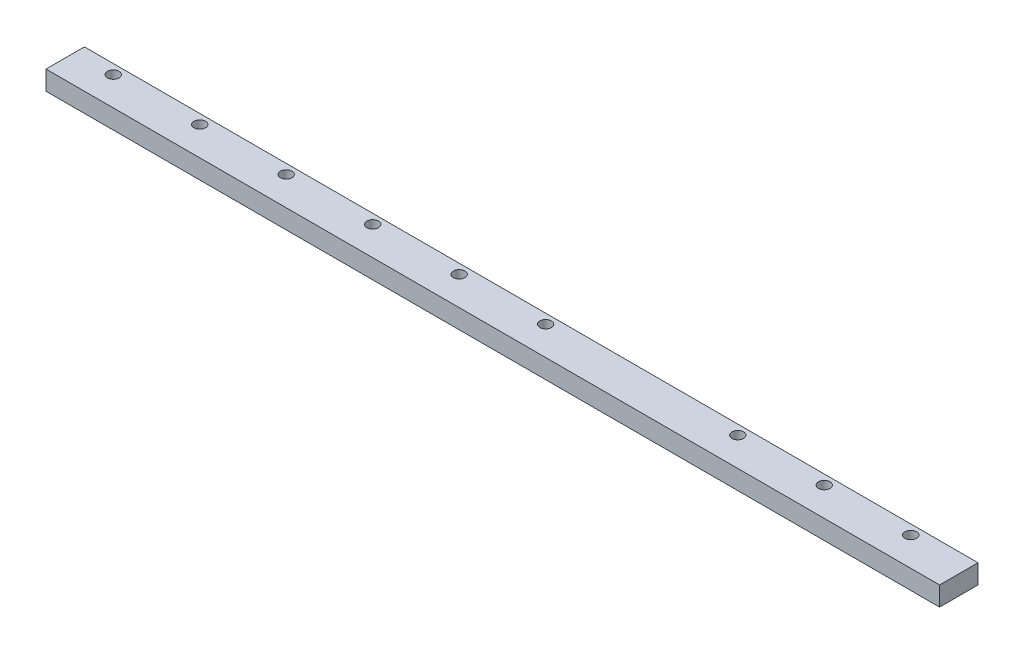
ISO-10303-21;
HEADER;
FILE_DESCRIPTION(('STEP AP214'),'2;1');
FILE_NAME('part.step','',(''),(''),'','','');
FILE_SCHEMA(('AUTOMOTIVE_DESIGN { 1 0 10303 214 1 1 1 1 }'));
ENDSEC;
DATA;
#1=APPLICATION_CONTEXT('core data for automotive mechanical design processes');
#2=APPLICATION_PROTOCOL_DEFINITION('international standard','automotive_design',2000,#1);
#3=PRODUCT_CONTEXT('',#1,'mechanical');
#4=PRODUCT('Part','Part','',(#3));
#5=PRODUCT_RELATED_PRODUCT_CATEGORY('part','',(#4));
#6=PRODUCT_DEFINITION_FORMATION('','',#4);
#7=PRODUCT_DEFINITION_CONTEXT('part definition',#1,'design');
#8=PRODUCT_DEFINITION('design','',#6,#7);
#9=PRODUCT_DEFINITION_SHAPE('','',#8);
#10=(LENGTH_UNIT() NAMED_UNIT(*) SI_UNIT(.MILLI.,.METRE.));
#11=(NAMED_UNIT(*) PLANE_ANGLE_UNIT() SI_UNIT($,.RADIAN.));
#12=(NAMED_UNIT(*) SI_UNIT($,.STERADIAN.) SOLID_ANGLE_UNIT());
#13=UNCERTAINTY_MEASURE_WITH_UNIT(LENGTH_MEASURE(1.E-05),#10,'distance_accuracy_value','');
#14=(GEOMETRIC_REPRESENTATION_CONTEXT(3) GLOBAL_UNCERTAINTY_ASSIGNED_CONTEXT((#13)) GLOBAL_UNIT_ASSIGNED_CONTEXT((#10,
#11,#12)) REPRESENTATION_CONTEXT('',''));
#15=CARTESIAN_POINT('',(0.,0.,0.));
#16=DIRECTION('',(0.,0.,1.));
#17=DIRECTION('',(1.,0.,0.));
#18=AXIS2_PLACEMENT_3D('',#15,#16,#17);
#19=CARTESIAN_POINT('',(0.,12.7,0.));
#20=DIRECTION('',(0.,-1.,0.));
#21=DIRECTION('',(0.,0.,-1.));
#22=AXIS2_PLACEMENT_3D('',#19,#20,#21);
#23=PLANE('',#22);
#24=CARTESIAN_POINT('',(-269.875,12.7,-6.35));
#25=DIRECTION('',(0.,1.,0.));
#26=DIRECTION('',(0.,0.,1.));
#27=AXIS2_PLACEMENT_3D('',#24,#25,#26);
#28=CIRCLE('',#27,3.80999999999998);
#29=CARTESIAN_POINT('',(-269.875,12.7,-2.54000000000002));
#30=VERTEX_POINT('',#29);
#31=EDGE_CURVE('E201',#30,#30,#28,.T.);
#32=ORIENTED_EDGE('',*,*,#31,.F.);
#33=EDGE_LOOP('',(#32));
#34=FACE_BOUND('',#33,.T.);
#35=CARTESIAN_POINT('',(142.875,12.7,-6.35));
#36=DIRECTION('',(0.,1.,0.));
#37=DIRECTION('',(0.,0.,1.));
#38=AXIS2_PLACEMENT_3D('',#35,#36,#37);
#39=CIRCLE('',#38,3.80999999999998);
#40=CARTESIAN_POINT('',(142.875,12.7,-2.54000000000002));
#41=VERTEX_POINT('',#40);
#42=EDGE_CURVE('E185',#41,#41,#39,.T.);
#43=ORIENTED_EDGE('',*,*,#42,.F.);
#44=EDGE_LOOP('',(#43));
#45=FACE_BOUND('',#44,.T.);
#46=CARTESIAN_POINT('',(-155.575,12.7,-6.35));
#47=DIRECTION('',(0.,1.,0.));
#48=DIRECTION('',(0.,0.,1.));
#49=AXIS2_PLACEMENT_3D('',#46,#47,#48);
#50=CIRCLE('',#49,3.80999999999998);
#51=CARTESIAN_POINT('',(-155.575,12.7,-2.54000000000002));
#52=VERTEX_POINT('',#51);
#53=EDGE_CURVE('E177',#52,#52,#50,.T.);
#54=ORIENTED_EDGE('',*,*,#53,.F.);
#55=EDGE_LOOP('',(#54));
#56=FACE_BOUND('',#55,.T.);
#57=CARTESIAN_POINT('',(-41.2750000000001,12.7,-6.35));
#58=DIRECTION('',(0.,1.,0.));
#59=DIRECTION('',(0.,0.,1.));
#60=AXIS2_PLACEMENT_3D('',#57,#58,#59);
#61=CIRCLE('',#60,3.80999999999999);
#62=CARTESIAN_POINT('',(-41.2750000000001,12.7,-2.54));
#63=VERTEX_POINT('',#62);
#64=EDGE_CURVE('E161',#63,#63,#61,.T.);
#65=ORIENTED_EDGE('',*,*,#64,.F.);
#66=EDGE_LOOP('',(#65));
#67=FACE_BOUND('',#66,.T.);
#68=CARTESIAN_POINT('',(15.875,12.7,-6.35));
#69=DIRECTION('',(0.,1.,0.));
#70=DIRECTION('',(0.,0.,1.));
#71=AXIS2_PLACEMENT_3D('',#68,#69,#70);
#72=CIRCLE('',#71,3.80999999999999);
#73=CARTESIAN_POINT('',(15.875,12.7,-2.54000000000001));
#74=VERTEX_POINT('',#73);
#75=EDGE_CURVE('E153',#74,#74,#72,.T.);
#76=ORIENTED_EDGE('',*,*,#75,.F.);
#77=EDGE_LOOP('',(#76));
#78=FACE_BOUND('',#77,.T.);
#79=CARTESIAN_POINT('',(257.175,12.7,-6.35));
#80=DIRECTION('',(0.,1.,0.));
#81=DIRECTION('',(0.,0.,1.));
#82=AXIS2_PLACEMENT_3D('',#79,#80,#81);
#83=CIRCLE('',#82,3.80999999999998);
#84=CARTESIAN_POINT('',(257.175,12.7,-2.54000000000002));
#85=VERTEX_POINT('',#84);
#86=EDGE_CURVE('E137',#85,#85,#83,.T.);
#87=ORIENTED_EDGE('',*,*,#86,.F.);
#88=EDGE_LOOP('',(#87));
#89=FACE_BOUND('',#88,.T.);
#90=DIRECTION('',(0.,0.,-1.));
#91=VECTOR('',#90,1.);
#92=CARTESIAN_POINT('',(295.275,12.7,12.7));
#93=LINE('',#92,#91);
#94=CARTESIAN_POINT('',(295.275,12.7,12.7));
#95=VERTEX_POINT('',#94);
#96=CARTESIAN_POINT('',(295.275,12.7,-12.7));
#97=VERTEX_POINT('',#96);
#98=EDGE_CURVE('E97',#95,#97,#93,.T.);
#99=ORIENTED_EDGE('',*,*,#98,.T.);
#100=DIRECTION('',(-1.,0.,0.));
#101=VECTOR('',#100,1.);
#102=CARTESIAN_POINT('',(-295.275,12.7,-12.7));
#103=LINE('',#102,#101);
#104=CARTESIAN_POINT('',(-295.275,12.7,-12.7));
#105=VERTEX_POINT('',#104);
#106=EDGE_CURVE('E92',#97,#105,#103,.T.);
#107=ORIENTED_EDGE('',*,*,#106,.T.);
#108=DIRECTION('',(0.,0.,1.));
#109=VECTOR('',#108,1.);
#110=CARTESIAN_POINT('',(-295.275,12.7,12.7));
#111=LINE('',#110,#109);
#112=CARTESIAN_POINT('',(-295.275,12.7,12.7));
#113=VERTEX_POINT('',#112);
#114=EDGE_CURVE('E95',#105,#113,#111,.T.);
#115=ORIENTED_EDGE('',*,*,#114,.T.);
#116=DIRECTION('',(1.,0.,0.));
#117=VECTOR('',#116,1.);
#118=CARTESIAN_POINT('',(-295.275,12.7,12.7));
#119=LINE('',#118,#117);
#120=EDGE_CURVE('E62',#113,#95,#119,.T.);
#121=ORIENTED_EDGE('',*,*,#120,.T.);
#122=EDGE_LOOP('',(#99,#107,#115,#121));
#123=FACE_BOUND('',#122,.T.);
#124=CARTESIAN_POINT('',(200.025,12.7,-6.35));
#125=DIRECTION('',(0.,1.,0.));
#126=DIRECTION('',(0.,0.,1.));
#127=AXIS2_PLACEMENT_3D('',#124,#125,#126);
#128=CIRCLE('',#127,3.80999999999998);
#129=CARTESIAN_POINT('',(200.025,12.7,-2.54000000000002));
#130=VERTEX_POINT('',#129);
#131=EDGE_CURVE('E145',#130,#130,#128,.T.);
#132=ORIENTED_EDGE('',*,*,#131,.F.);
#133=EDGE_LOOP('',(#132));
#134=FACE_BOUND('',#133,.T.);
#135=CARTESIAN_POINT('',(-98.4250000000001,12.7,-6.35));
#136=DIRECTION('',(0.,1.,0.));
#137=DIRECTION('',(0.,0.,1.));
#138=AXIS2_PLACEMENT_3D('',#135,#136,#137);
#139=CIRCLE('',#138,3.80999999999999);
#140=CARTESIAN_POINT('',(-98.4250000000001,12.7,-2.54));
#141=VERTEX_POINT('',#140);
#142=EDGE_CURVE('E169',#141,#141,#139,.T.);
#143=ORIENTED_EDGE('',*,*,#142,.F.);
#144=EDGE_LOOP('',(#143));
#145=FACE_BOUND('',#144,.T.);
#146=CARTESIAN_POINT('',(-212.725,12.7,-6.35));
#147=DIRECTION('',(0.,1.,0.));
#148=DIRECTION('',(0.,0.,1.));
#149=AXIS2_PLACEMENT_3D('',#146,#147,#148);
#150=CIRCLE('',#149,3.80999999999998);
#151=CARTESIAN_POINT('',(-212.725,12.7,-2.54000000000002));
#152=VERTEX_POINT('',#151);
#153=EDGE_CURVE('E193',#152,#152,#150,.T.);
#154=ORIENTED_EDGE('',*,*,#153,.F.);
#155=EDGE_LOOP('',(#154));
#156=FACE_BOUND('',#155,.T.);
#157=ADVANCED_FACE('F44',(#34,#45,#56,#67,#78,#89,#123,#134,#145,#156),#23,.F.);
#158=CARTESIAN_POINT('',(295.275,12.7,12.7));
#159=DIRECTION('',(-1.,0.,0.));
#160=DIRECTION('',(0.,0.,1.));
#161=AXIS2_PLACEMENT_3D('',#158,#159,#160);
#162=PLANE('',#161);
#163=DIRECTION('',(0.,0.,-1.));
#164=VECTOR('',#163,1.);
#165=CARTESIAN_POINT('',(295.275,0.,12.7));
#166=LINE('',#165,#164);
#167=CARTESIAN_POINT('',(295.275,0.,12.7));
#168=VERTEX_POINT('',#167);
#169=CARTESIAN_POINT('',(295.275,0.,-12.7));
#170=VERTEX_POINT('',#169);
#171=EDGE_CURVE('E113',#168,#170,#166,.T.);
#172=ORIENTED_EDGE('',*,*,#171,.T.);
#173=DIRECTION('',(0.,-1.,0.));
#174=VECTOR('',#173,1.);
#175=CARTESIAN_POINT('',(295.275,12.7,-12.7));
#176=LINE('',#175,#174);
#177=EDGE_CURVE('E11',#97,#170,#176,.T.);
#178=ORIENTED_EDGE('',*,*,#177,.F.);
#179=ORIENTED_EDGE('',*,*,#98,.F.);
#180=DIRECTION('',(0.,-1.,0.));
#181=VECTOR('',#180,1.);
#182=CARTESIAN_POINT('',(295.275,12.7,12.7));
#183=LINE('',#182,#181);
#184=EDGE_CURVE('E109',#95,#168,#183,.T.);
#185=ORIENTED_EDGE('',*,*,#184,.T.);
#186=EDGE_LOOP('',(#172,#178,#179,#185));
#187=FACE_BOUND('',#186,.T.);
#188=ADVANCED_FACE('F46',(#187),#162,.F.);
#189=CARTESIAN_POINT('',(-295.275,12.7,-12.7));
#190=DIRECTION('',(0.,0.,1.));
#191=DIRECTION('',(1.,0.,0.));
#192=AXIS2_PLACEMENT_3D('',#189,#190,#191);
#193=PLANE('',#192);
#194=DIRECTION('',(-1.,0.,0.));
#195=VECTOR('',#194,1.);
#196=CARTESIAN_POINT('',(-295.275,0.,-12.7));
#197=LINE('',#196,#195);
#198=CARTESIAN_POINT('',(-295.275,0.,-12.7));
#199=VERTEX_POINT('',#198);
#200=EDGE_CURVE('E102',#170,#199,#197,.T.);
#201=ORIENTED_EDGE('',*,*,#200,.T.);
#202=DIRECTION('',(0.,-1.,0.));
#203=VECTOR('',#202,1.);
#204=CARTESIAN_POINT('',(-295.275,12.7,-12.7));
#205=LINE('',#204,#203);
#206=EDGE_CURVE('E54',#105,#199,#205,.T.);
#207=ORIENTED_EDGE('',*,*,#206,.F.);
#208=ORIENTED_EDGE('',*,*,#106,.F.);
#209=ORIENTED_EDGE('',*,*,#177,.T.);
#210=EDGE_LOOP('',(#201,#207,#208,#209));
#211=FACE_BOUND('',#210,.T.);
#212=ADVANCED_FACE('F101',(#211),#193,.F.);
#213=CARTESIAN_POINT('',(-295.275,12.7,12.7));
#214=DIRECTION('',(1.,0.,0.));
#215=DIRECTION('',(0.,0.,-1.));
#216=AXIS2_PLACEMENT_3D('',#213,#214,#215);
#217=PLANE('',#216);
#218=DIRECTION('',(0.,0.,1.));
#219=VECTOR('',#218,1.);
#220=CARTESIAN_POINT('',(-295.275,0.,12.7));
#221=LINE('',#220,#219);
#222=CARTESIAN_POINT('',(-295.275,0.,12.7));
#223=VERTEX_POINT('',#222);
#224=EDGE_CURVE('E79',#199,#223,#221,.T.);
#225=ORIENTED_EDGE('',*,*,#224,.T.);
#226=DIRECTION('',(0.,-1.,0.));
#227=VECTOR('',#226,1.);
#228=CARTESIAN_POINT('',(-295.275,12.7,12.7));
#229=LINE('',#228,#227);
#230=EDGE_CURVE('E104',#113,#223,#229,.T.);
#231=ORIENTED_EDGE('',*,*,#230,.F.);
#232=ORIENTED_EDGE('',*,*,#114,.F.);
#233=ORIENTED_EDGE('',*,*,#206,.T.);
#234=EDGE_LOOP('',(#225,#231,#232,#233));
#235=FACE_BOUND('',#234,.T.);
#236=ADVANCED_FACE('F105',(#235),#217,.F.);
#237=CARTESIAN_POINT('',(-295.275,12.7,12.7));
#238=DIRECTION('',(0.,0.,-1.));
#239=DIRECTION('',(-1.,0.,0.));
#240=AXIS2_PLACEMENT_3D('',#237,#238,#239);
#241=PLANE('',#240);
#242=DIRECTION('',(1.,0.,0.));
#243=VECTOR('',#242,1.);
#244=CARTESIAN_POINT('',(-295.275,0.,12.7));
#245=LINE('',#244,#243);
#246=EDGE_CURVE('E85',#223,#168,#245,.T.);
#247=ORIENTED_EDGE('',*,*,#246,.T.);
#248=ORIENTED_EDGE('',*,*,#184,.F.);
#249=ORIENTED_EDGE('',*,*,#120,.F.);
#250=ORIENTED_EDGE('',*,*,#230,.T.);
#251=EDGE_LOOP('',(#247,#248,#249,#250));
#252=FACE_BOUND('',#251,.T.);
#253=ADVANCED_FACE('F127',(#252),#241,.F.);
#254=CARTESIAN_POINT('',(0.,0.,0.));
#255=DIRECTION('',(0.,-1.,0.));
#256=DIRECTION('',(0.,0.,-1.));
#257=AXIS2_PLACEMENT_3D('',#254,#255,#256);
#258=PLANE('',#257);
#259=CARTESIAN_POINT('',(-269.875,0.,-6.35));
#260=DIRECTION('',(0.,-1.,0.));
#261=DIRECTION('',(0.,0.,-1.));
#262=AXIS2_PLACEMENT_3D('',#259,#260,#261);
#263=CIRCLE('',#262,3.80999999999998);
#264=CARTESIAN_POINT('',(-269.875,0.,-10.16));
#265=VERTEX_POINT('',#264);
#266=EDGE_CURVE('E197',#265,#265,#263,.F.);
#267=ORIENTED_EDGE('',*,*,#266,.T.);
#268=EDGE_LOOP('',(#267));
#269=FACE_BOUND('',#268,.T.);
#270=CARTESIAN_POINT('',(-212.725,0.,-6.35));
#271=DIRECTION('',(0.,-1.,0.));
#272=DIRECTION('',(0.,0.,-1.));
#273=AXIS2_PLACEMENT_3D('',#270,#271,#272);
#274=CIRCLE('',#273,3.80999999999998);
#275=CARTESIAN_POINT('',(-212.725,0.,-10.16));
#276=VERTEX_POINT('',#275);
#277=EDGE_CURVE('E189',#276,#276,#274,.F.);
#278=ORIENTED_EDGE('',*,*,#277,.T.);
#279=EDGE_LOOP('',(#278));
#280=FACE_BOUND('',#279,.T.);
#281=CARTESIAN_POINT('',(142.875,0.,-6.35));
#282=DIRECTION('',(0.,-1.,0.));
#283=DIRECTION('',(0.,0.,-1.));
#284=AXIS2_PLACEMENT_3D('',#281,#282,#283);
#285=CIRCLE('',#284,3.80999999999998);
#286=CARTESIAN_POINT('',(142.875,0.,-10.16));
#287=VERTEX_POINT('',#286);
#288=EDGE_CURVE('E181',#287,#287,#285,.F.);
#289=ORIENTED_EDGE('',*,*,#288,.T.);
#290=EDGE_LOOP('',(#289));
#291=FACE_BOUND('',#290,.T.);
#292=CARTESIAN_POINT('',(-155.575,0.,-6.35));
#293=DIRECTION('',(0.,-1.,0.));
#294=DIRECTION('',(0.,0.,-1.));
#295=AXIS2_PLACEMENT_3D('',#292,#293,#294);
#296=CIRCLE('',#295,3.80999999999998);
#297=CARTESIAN_POINT('',(-155.575,0.,-10.16));
#298=VERTEX_POINT('',#297);
#299=EDGE_CURVE('E173',#298,#298,#296,.F.);
#300=ORIENTED_EDGE('',*,*,#299,.T.);
#301=EDGE_LOOP('',(#300));
#302=FACE_BOUND('',#301,.T.);
#303=CARTESIAN_POINT('',(-98.4250000000001,0.,-6.35));
#304=DIRECTION('',(0.,-1.,0.));
#305=DIRECTION('',(0.,0.,-1.));
#306=AXIS2_PLACEMENT_3D('',#303,#304,#305);
#307=CIRCLE('',#306,3.80999999999999);
#308=CARTESIAN_POINT('',(-98.4250000000001,0.,-10.16));
#309=VERTEX_POINT('',#308);
#310=EDGE_CURVE('E165',#309,#309,#307,.F.);
#311=ORIENTED_EDGE('',*,*,#310,.T.);
#312=EDGE_LOOP('',(#311));
#313=FACE_BOUND('',#312,.T.);
#314=CARTESIAN_POINT('',(-41.2750000000001,0.,-6.35));
#315=DIRECTION('',(0.,-1.,0.));
#316=DIRECTION('',(0.,0.,-1.));
#317=AXIS2_PLACEMENT_3D('',#314,#315,#316);
#318=CIRCLE('',#317,3.80999999999999);
#319=CARTESIAN_POINT('',(-41.2750000000001,0.,-10.16));
#320=VERTEX_POINT('',#319);
#321=EDGE_CURVE('E157',#320,#320,#318,.F.);
#322=ORIENTED_EDGE('',*,*,#321,.T.);
#323=EDGE_LOOP('',(#322));
#324=FACE_BOUND('',#323,.T.);
#325=CARTESIAN_POINT('',(15.875,0.,-6.35));
#326=DIRECTION('',(0.,-1.,0.));
#327=DIRECTION('',(0.,0.,-1.));
#328=AXIS2_PLACEMENT_3D('',#325,#326,#327);
#329=CIRCLE('',#328,3.80999999999999);
#330=CARTESIAN_POINT('',(15.875,0.,-10.16));
#331=VERTEX_POINT('',#330);
#332=EDGE_CURVE('E149',#331,#331,#329,.F.);
#333=ORIENTED_EDGE('',*,*,#332,.T.);
#334=EDGE_LOOP('',(#333));
#335=FACE_BOUND('',#334,.T.);
#336=CARTESIAN_POINT('',(200.025,0.,-6.35));
#337=DIRECTION('',(0.,-1.,0.));
#338=DIRECTION('',(0.,0.,-1.));
#339=AXIS2_PLACEMENT_3D('',#336,#337,#338);
#340=CIRCLE('',#339,3.80999999999998);
#341=CARTESIAN_POINT('',(200.025,0.,-10.16));
#342=VERTEX_POINT('',#341);
#343=EDGE_CURVE('E141',#342,#342,#340,.F.);
#344=ORIENTED_EDGE('',*,*,#343,.T.);
#345=EDGE_LOOP('',(#344));
#346=FACE_BOUND('',#345,.T.);
#347=CARTESIAN_POINT('',(257.175,0.,-6.35));
#348=DIRECTION('',(0.,-1.,0.));
#349=DIRECTION('',(0.,0.,-1.));
#350=AXIS2_PLACEMENT_3D('',#347,#348,#349);
#351=CIRCLE('',#350,3.80999999999998);
#352=CARTESIAN_POINT('',(257.175,0.,-10.16));
#353=VERTEX_POINT('',#352);
#354=EDGE_CURVE('E117',#353,#353,#351,.F.);
#355=ORIENTED_EDGE('',*,*,#354,.T.);
#356=EDGE_LOOP('',(#355));
#357=FACE_BOUND('',#356,.T.);
#358=ORIENTED_EDGE('',*,*,#171,.F.);
#359=ORIENTED_EDGE('',*,*,#246,.F.);
#360=ORIENTED_EDGE('',*,*,#224,.F.);
#361=ORIENTED_EDGE('',*,*,#200,.F.);
#362=EDGE_LOOP('',(#358,#359,#360,#361));
#363=FACE_BOUND('',#362,.T.);
#364=ADVANCED_FACE('F130',(#269,#280,#291,#302,#313,#324,#335,#346,#357,#363),#258,.T.);
#365=CARTESIAN_POINT('',(257.175,12.7,-6.35));
#366=DIRECTION('',(0.,1.,0.));
#367=DIRECTION('',(0.,0.,1.));
#368=AXIS2_PLACEMENT_3D('',#365,#366,#367);
#369=CYLINDRICAL_SURFACE('',#368,3.80999999999998);
#370=ORIENTED_EDGE('',*,*,#354,.F.);
#371=EDGE_LOOP('',(#370));
#372=FACE_BOUND('',#371,.T.);
#373=ORIENTED_EDGE('',*,*,#86,.T.);
#374=EDGE_LOOP('',(#373));
#375=FACE_BOUND('',#374,.T.);
#376=ADVANCED_FACE('F221',(#372,#375),#369,.F.);
#377=CARTESIAN_POINT('',(200.025,12.7,-6.35));
#378=DIRECTION('',(0.,1.,0.));
#379=DIRECTION('',(0.,0.,1.));
#380=AXIS2_PLACEMENT_3D('',#377,#378,#379);
#381=CYLINDRICAL_SURFACE('',#380,3.80999999999998);
#382=ORIENTED_EDGE('',*,*,#343,.F.);
#383=EDGE_LOOP('',(#382));
#384=FACE_BOUND('',#383,.T.);
#385=ORIENTED_EDGE('',*,*,#131,.T.);
#386=EDGE_LOOP('',(#385));
#387=FACE_BOUND('',#386,.T.);
#388=ADVANCED_FACE('F223',(#384,#387),#381,.F.);
#389=CARTESIAN_POINT('',(15.875,12.7,-6.35));
#390=DIRECTION('',(0.,1.,0.));
#391=DIRECTION('',(0.,0.,1.));
#392=AXIS2_PLACEMENT_3D('',#389,#390,#391);
#393=CYLINDRICAL_SURFACE('',#392,3.80999999999999);
#394=ORIENTED_EDGE('',*,*,#332,.F.);
#395=EDGE_LOOP('',(#394));
#396=FACE_BOUND('',#395,.T.);
#397=ORIENTED_EDGE('',*,*,#75,.T.);
#398=EDGE_LOOP('',(#397));
#399=FACE_BOUND('',#398,.T.);
#400=ADVANCED_FACE('F230',(#396,#399),#393,.F.);
#401=CARTESIAN_POINT('',(-41.2750000000001,12.7,-6.35));
#402=DIRECTION('',(0.,1.,0.));
#403=DIRECTION('',(0.,0.,1.));
#404=AXIS2_PLACEMENT_3D('',#401,#402,#403);
#405=CYLINDRICAL_SURFACE('',#404,3.80999999999999);
#406=ORIENTED_EDGE('',*,*,#321,.F.);
#407=EDGE_LOOP('',(#406));
#408=FACE_BOUND('',#407,.T.);
#409=ORIENTED_EDGE('',*,*,#64,.T.);
#410=EDGE_LOOP('',(#409));
#411=FACE_BOUND('',#410,.T.);
#412=ADVANCED_FACE('F294',(#408,#411),#405,.F.);
#413=CARTESIAN_POINT('',(-98.4250000000001,12.7,-6.35));
#414=DIRECTION('',(0.,1.,0.));
#415=DIRECTION('',(0.,0.,1.));
#416=AXIS2_PLACEMENT_3D('',#413,#414,#415);
#417=CYLINDRICAL_SURFACE('',#416,3.80999999999999);
#418=ORIENTED_EDGE('',*,*,#310,.F.);
#419=EDGE_LOOP('',(#418));
#420=FACE_BOUND('',#419,.T.);
#421=ORIENTED_EDGE('',*,*,#142,.T.);
#422=EDGE_LOOP('',(#421));
#423=FACE_BOUND('',#422,.T.);
#424=ADVANCED_FACE('F303',(#420,#423),#417,.F.);
#425=CARTESIAN_POINT('',(-155.575,12.7,-6.35));
#426=DIRECTION('',(0.,1.,0.));
#427=DIRECTION('',(0.,0.,1.));
#428=AXIS2_PLACEMENT_3D('',#425,#426,#427);
#429=CYLINDRICAL_SURFACE('',#428,3.80999999999998);
#430=ORIENTED_EDGE('',*,*,#299,.F.);
#431=EDGE_LOOP('',(#430));
#432=FACE_BOUND('',#431,.T.);
#433=ORIENTED_EDGE('',*,*,#53,.T.);
#434=EDGE_LOOP('',(#433));
#435=FACE_BOUND('',#434,.T.);
#436=ADVANCED_FACE('F313',(#432,#435),#429,.F.);
#437=CARTESIAN_POINT('',(142.875,12.7,-6.35));
#438=DIRECTION('',(0.,1.,0.));
#439=DIRECTION('',(0.,0.,1.));
#440=AXIS2_PLACEMENT_3D('',#437,#438,#439);
#441=CYLINDRICAL_SURFACE('',#440,3.80999999999998);
#442=ORIENTED_EDGE('',*,*,#288,.F.);
#443=EDGE_LOOP('',(#442));
#444=FACE_BOUND('',#443,.T.);
#445=ORIENTED_EDGE('',*,*,#42,.T.);
#446=EDGE_LOOP('',(#445));
#447=FACE_BOUND('',#446,.T.);
#448=ADVANCED_FACE('F323',(#444,#447),#441,.F.);
#449=CARTESIAN_POINT('',(-212.725,12.7,-6.35));
#450=DIRECTION('',(0.,1.,0.));
#451=DIRECTION('',(0.,0.,1.));
#452=AXIS2_PLACEMENT_3D('',#449,#450,#451);
#453=CYLINDRICAL_SURFACE('',#452,3.80999999999998);
#454=ORIENTED_EDGE('',*,*,#277,.F.);
#455=EDGE_LOOP('',(#454));
#456=FACE_BOUND('',#455,.T.);
#457=ORIENTED_EDGE('',*,*,#153,.T.);
#458=EDGE_LOOP('',(#457));
#459=FACE_BOUND('',#458,.T.);
#460=ADVANCED_FACE('F333',(#456,#459),#453,.F.);
#461=CARTESIAN_POINT('',(-269.875,12.7,-6.35));
#462=DIRECTION('',(0.,1.,0.));
#463=DIRECTION('',(0.,0.,1.));
#464=AXIS2_PLACEMENT_3D('',#461,#462,#463);
#465=CYLINDRICAL_SURFACE('',#464,3.80999999999998);
#466=ORIENTED_EDGE('',*,*,#266,.F.);
#467=EDGE_LOOP('',(#466));
#468=FACE_BOUND('',#467,.T.);
#469=ORIENTED_EDGE('',*,*,#31,.T.);
#470=EDGE_LOOP('',(#469));
#471=FACE_BOUND('',#470,.T.);
#472=ADVANCED_FACE('F206',(#468,#471),#465,.F.);
#473=CLOSED_SHELL('',(#157,#188,#212,#236,#253,#364,#376,#388,#400,#412,#424,#436,#448,#460,#472));
#474=MANIFOLD_SOLID_BREP('B2',#473);
#475=ADVANCED_BREP_SHAPE_REPRESENTATION('',(#18,#474),#14);
#476=SHAPE_DEFINITION_REPRESENTATION(#9,#475);
ENDSEC;
END-ISO-10303-21;
